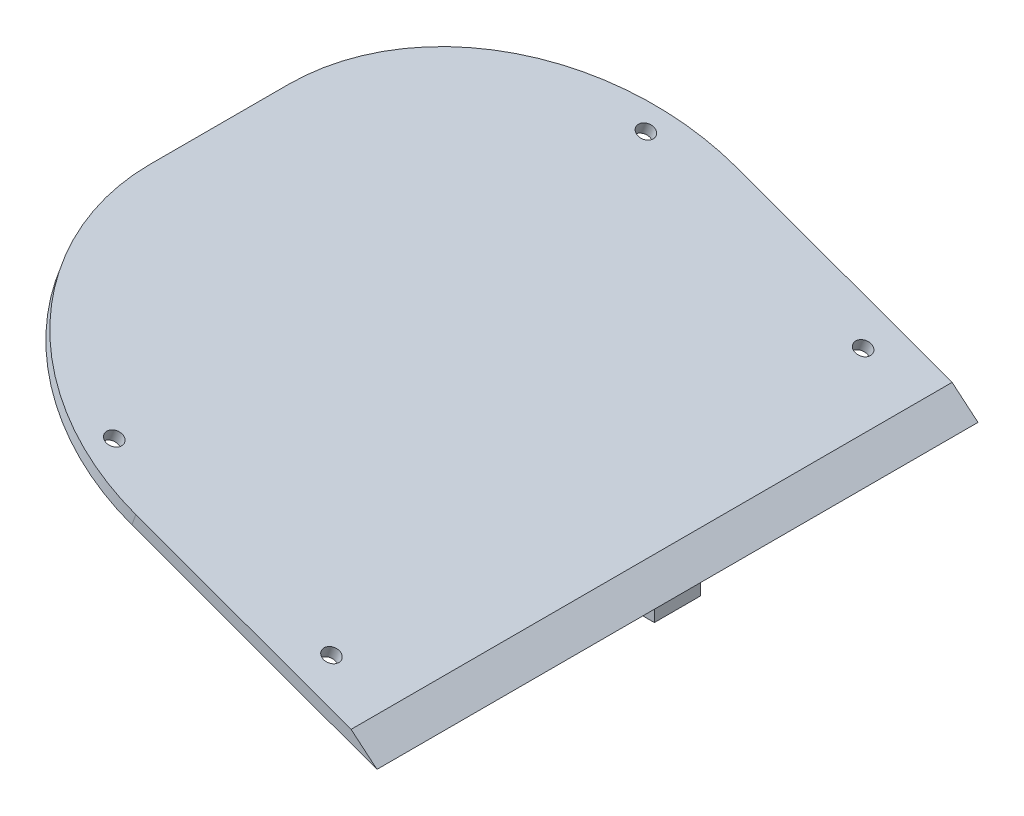
ISO-10303-21;
HEADER;
FILE_DESCRIPTION(('STEP AP214'),'2;1');
FILE_NAME('part.step','',(''),(''),'','','');
FILE_SCHEMA(('AUTOMOTIVE_DESIGN { 1 0 10303 214 1 1 1 1 }'));
ENDSEC;
DATA;
#1=APPLICATION_CONTEXT('core data for automotive mechanical design processes');
#2=APPLICATION_PROTOCOL_DEFINITION('international standard','automotive_design',2000,#1);
#3=PRODUCT_CONTEXT('',#1,'mechanical');
#4=PRODUCT('Part','Part','',(#3));
#5=PRODUCT_RELATED_PRODUCT_CATEGORY('part','',(#4));
#6=PRODUCT_DEFINITION_FORMATION('','',#4);
#7=PRODUCT_DEFINITION_CONTEXT('part definition',#1,'design');
#8=PRODUCT_DEFINITION('design','',#6,#7);
#9=PRODUCT_DEFINITION_SHAPE('','',#8);
#10=(LENGTH_UNIT() NAMED_UNIT(*) SI_UNIT(.MILLI.,.METRE.));
#11=(NAMED_UNIT(*) PLANE_ANGLE_UNIT() SI_UNIT($,.RADIAN.));
#12=(NAMED_UNIT(*) SI_UNIT($,.STERADIAN.) SOLID_ANGLE_UNIT());
#13=UNCERTAINTY_MEASURE_WITH_UNIT(LENGTH_MEASURE(1.E-05),#10,'distance_accuracy_value','');
#14=(GEOMETRIC_REPRESENTATION_CONTEXT(3) GLOBAL_UNCERTAINTY_ASSIGNED_CONTEXT((#13)) GLOBAL_UNIT_ASSIGNED_CONTEXT((#10,
#11,#12)) REPRESENTATION_CONTEXT('',''));
#15=CARTESIAN_POINT('',(0.,0.,0.));
#16=DIRECTION('',(0.,0.,1.));
#17=DIRECTION('',(1.,0.,0.));
#18=AXIS2_PLACEMENT_3D('',#15,#16,#17);
#19=CARTESIAN_POINT('',(1.65853487042235,4.55678710586349,0.));
#20=DIRECTION('',(-0.342020143325669,-0.939692620785908,0.));
#21=DIRECTION('',(0.939692620785908,-0.342020143325669,0.));
#22=AXIS2_PLACEMENT_3D('',#19,#20,#21);
#23=PLANE('',#22);
#24=DIRECTION('',(-0.939692620785908,0.342020143325669,0.));
#25=VECTOR('',#24,1.);
#26=CARTESIAN_POINT('',(0.855050358314189,4.84923155196477,-65.));
#27=LINE('',#26,#25);
#28=CARTESIAN_POINT('',(-5.59941028377931,7.19846310392953,-65.));
#29=VERTEX_POINT('',#28);
#30=CARTESIAN_POINT('',(-52.1603186023903,24.1452478123016,-65.));
#31=VERTEX_POINT('',#30);
#32=EDGE_CURVE('E220',#29,#31,#27,.T.);
#33=ORIENTED_EDGE('',*,*,#32,.T.);
#34=CARTESIAN_POINT('',(-52.1603186023904,24.1452478123016,-15.));
#35=DIRECTION('',(-0.342020143325669,-0.939692620785908,0.));
#36=DIRECTION('',(0.939692620785908,-0.342020143325669,0.));
#37=AXIS2_PLACEMENT_3D('',#34,#35,#36);
#38=CIRCLE('',#37,50.);
#39=CARTESIAN_POINT('',(-99.1449496416858,41.2462549785851,-15.));
#40=VERTEX_POINT('',#39);
#41=EDGE_CURVE('E340',#31,#40,#38,.F.);
#42=ORIENTED_EDGE('',*,*,#41,.T.);
#43=DIRECTION('',(0.,0.,1.));
#44=VECTOR('',#43,1.);
#45=CARTESIAN_POINT('',(-99.1449496416858,41.2462549785851,-65.));
#46=LINE('',#45,#44);
#47=CARTESIAN_POINT('',(-99.1449496416858,41.2462549785851,15.));
#48=VERTEX_POINT('',#47);
#49=EDGE_CURVE('E223',#40,#48,#46,.T.);
#50=ORIENTED_EDGE('',*,*,#49,.T.);
#51=CARTESIAN_POINT('',(-52.1603186023904,24.1452478123016,15.));
#52=DIRECTION('',(-0.342020143325669,-0.939692620785908,0.));
#53=DIRECTION('',(0.939692620785908,-0.342020143325669,0.));
#54=AXIS2_PLACEMENT_3D('',#51,#52,#53);
#55=CIRCLE('',#54,50.);
#56=CARTESIAN_POINT('',(-52.1603186023904,24.1452478123016,65.));
#57=VERTEX_POINT('',#56);
#58=EDGE_CURVE('E59',#48,#57,#55,.F.);
#59=ORIENTED_EDGE('',*,*,#58,.T.);
#60=DIRECTION('',(0.939692620785908,-0.342020143325669,0.));
#61=VECTOR('',#60,1.);
#62=CARTESIAN_POINT('',(0.855050358314189,4.84923155196477,65.));
#63=LINE('',#62,#61);
#64=CARTESIAN_POINT('',(-5.59941028377931,7.19846310392953,65.));
#65=VERTEX_POINT('',#64);
#66=EDGE_CURVE('E226',#57,#65,#63,.T.);
#67=ORIENTED_EDGE('',*,*,#66,.T.);
#68=DIRECTION('',(0.,0.,-1.));
#69=VECTOR('',#68,1.);
#70=CARTESIAN_POINT('',(-5.59941028377932,7.19846310392953,0.));
#71=LINE('',#70,#69);
#72=EDGE_CURVE('E322',#65,#29,#71,.T.);
#73=ORIENTED_EDGE('',*,*,#72,.T.);
#74=EDGE_LOOP('',(#33,#42,#50,#59,#67,#73));
#75=FACE_BOUND('',#74,.T.);
#76=CARTESIAN_POINT('',(-17.3455680436028,11.4737148955003,-57.4999999999997));
#77=DIRECTION('',(0.34202014332567,0.939692620785908,0.));
#78=DIRECTION('',(-0.939692620785908,0.34202014332567,0.));
#79=AXIS2_PLACEMENT_3D('',#76,#77,#78);
#80=CIRCLE('',#79,1.69999999999999);
#81=CARTESIAN_POINT('',(-18.9430454989388,12.0551491391539,-57.4999999999997));
#82=VERTEX_POINT('',#81);
#83=EDGE_CURVE('E772',#82,#82,#80,.T.);
#84=ORIENTED_EDGE('',*,*,#83,.F.);
#85=EDGE_LOOP('',(#84));
#86=FACE_BOUND('',#85,.T.);
#87=CARTESIAN_POINT('',(-17.3455680436028,11.4737148955003,57.4999999999997));
#88=DIRECTION('',(0.34202014332567,0.939692620785908,0.));
#89=DIRECTION('',(-0.939692620785908,0.34202014332567,0.));
#90=AXIS2_PLACEMENT_3D('',#87,#88,#89);
#91=CIRCLE('',#90,1.69999999999999);
#92=CARTESIAN_POINT('',(-18.9430454989388,12.0551491391539,57.4999999999997));
#93=VERTEX_POINT('',#92);
#94=EDGE_CURVE('E766',#93,#93,#91,.T.);
#95=ORIENTED_EDGE('',*,*,#94,.F.);
#96=EDGE_LOOP('',(#95));
#97=FACE_BOUND('',#96,.T.);
#98=CARTESIAN_POINT('',(-64.3301990828997,28.5747220617843,57.4999999999997));
#99=DIRECTION('',(0.34202014332567,0.939692620785908,0.));
#100=DIRECTION('',(-0.939692620785908,0.34202014332567,0.));
#101=AXIS2_PLACEMENT_3D('',#98,#99,#100);
#102=CIRCLE('',#101,1.69999999999999);
#103=CARTESIAN_POINT('',(-65.9276765382357,29.1561563054379,57.4999999999997));
#104=VERTEX_POINT('',#103);
#105=EDGE_CURVE('E757',#104,#104,#102,.T.);
#106=ORIENTED_EDGE('',*,*,#105,.F.);
#107=EDGE_LOOP('',(#106));
#108=FACE_BOUND('',#107,.T.);
#109=CARTESIAN_POINT('',(-64.3301990828997,28.5747220617843,-57.4999999999997));
#110=DIRECTION('',(0.34202014332567,0.939692620785908,0.));
#111=DIRECTION('',(-0.939692620785908,0.34202014332567,0.));
#112=AXIS2_PLACEMENT_3D('',#109,#110,#111);
#113=CIRCLE('',#112,1.69999999999999);
#114=CARTESIAN_POINT('',(-65.9276765382357,29.1561563054379,-57.4999999999997));
#115=VERTEX_POINT('',#114);
#116=EDGE_CURVE('E753',#115,#115,#113,.T.);
#117=ORIENTED_EDGE('',*,*,#116,.F.);
#118=EDGE_LOOP('',(#117));
#119=FACE_BOUND('',#118,.T.);
#120=ADVANCED_FACE('F38',(#75,#86,#97,#108,#119),#23,.F.);
#121=CARTESIAN_POINT('',(0.803484512108176,2.20755555389872,0.));
#122=DIRECTION('',(-0.342020143325669,-0.939692620785908,0.));
#123=DIRECTION('',(0.939692620785908,-0.342020143325669,0.));
#124=AXIS2_PLACEMENT_3D('',#121,#122,#123);
#125=PLANE('',#124);
#126=CARTESIAN_POINT('',(-65.1852494412139,26.2254905098195,-57.4999999999997));
#127=DIRECTION('',(-0.342020143325669,-0.939692620785908,0.));
#128=DIRECTION('',(0.939692620785908,-0.342020143325669,0.));
#129=AXIS2_PLACEMENT_3D('',#126,#127,#128);
#130=CIRCLE('',#129,1.69999999999999);
#131=CARTESIAN_POINT('',(-63.5877719858778,25.6440562661659,-57.4999999999997));
#132=VERTEX_POINT('',#131);
#133=EDGE_CURVE('E756',#132,#132,#130,.T.);
#134=ORIENTED_EDGE('',*,*,#133,.F.);
#135=EDGE_LOOP('',(#134));
#136=FACE_BOUND('',#135,.T.);
#137=DIRECTION('',(0.,0.,1.));
#138=VECTOR('',#137,1.);
#139=CARTESIAN_POINT('',(-100.,38.8970234266203,-65.));
#140=LINE('',#139,#138);
#141=CARTESIAN_POINT('',(-100.,38.8970234266203,-15.));
#142=VERTEX_POINT('',#141);
#143=CARTESIAN_POINT('',(-100.,38.8970234266203,-5.));
#144=VERTEX_POINT('',#143);
#145=EDGE_CURVE('E238',#142,#144,#140,.T.);
#146=ORIENTED_EDGE('',*,*,#145,.F.);
#147=CARTESIAN_POINT('',(-53.0153689607045,21.7960162603368,-15.));
#148=DIRECTION('',(-0.342020143325669,-0.939692620785908,0.));
#149=DIRECTION('',(0.939692620785908,-0.342020143325669,0.));
#150=AXIS2_PLACEMENT_3D('',#147,#148,#149);
#151=CIRCLE('',#150,50.);
#152=CARTESIAN_POINT('',(-53.0153689607045,21.7960162603368,-65.));
#153=VERTEX_POINT('',#152);
#154=EDGE_CURVE('E335',#142,#153,#151,.T.);
#155=ORIENTED_EDGE('',*,*,#154,.T.);
#156=DIRECTION('',(-0.939692620785908,0.342020143325669,0.));
#157=VECTOR('',#156,1.);
#158=CARTESIAN_POINT('',(0.,2.5,-65.));
#159=LINE('',#158,#157);
#160=CARTESIAN_POINT('',(-43.6309785619984,18.3803774884742,-65.));
#161=VERTEX_POINT('',#160);
#162=EDGE_CURVE('E232',#161,#153,#159,.T.);
#163=ORIENTED_EDGE('',*,*,#162,.F.);
#164=DIRECTION('',(0.,0.,1.));
#165=VECTOR('',#164,1.);
#166=CARTESIAN_POINT('',(-43.6309785619984,18.3803774884742,0.));
#167=LINE('',#166,#165);
#168=CARTESIAN_POINT('',(-43.6309785619984,18.3803774884742,-5.));
#169=VERTEX_POINT('',#168);
#170=EDGE_CURVE('E192',#161,#169,#167,.T.);
#171=ORIENTED_EDGE('',*,*,#170,.T.);
#172=DIRECTION('',(-0.939692620785908,0.342020143325669,0.));
#173=VECTOR('',#172,1.);
#174=CARTESIAN_POINT('',(0.,2.5,-5.));
#175=LINE('',#174,#173);
#176=EDGE_CURVE('E200',#169,#144,#175,.T.);
#177=ORIENTED_EDGE('',*,*,#176,.T.);
#178=EDGE_LOOP('',(#146,#155,#163,#171,#177));
#179=FACE_BOUND('',#178,.T.);
#180=ADVANCED_FACE('F403',(#136,#179),#125,.T.);
#181=CARTESIAN_POINT('',(-65.1852494412138,26.2254905098195,57.4999999999997));
#182=DIRECTION('',(-0.342020143325669,-0.939692620785908,0.));
#183=DIRECTION('',(0.939692620785908,-0.342020143325669,0.));
#184=AXIS2_PLACEMENT_3D('',#181,#182,#183);
#185=CIRCLE('',#184,1.69999999999999);
#186=CARTESIAN_POINT('',(-63.5877719858778,25.6440562661659,57.4999999999997));
#187=VERTEX_POINT('',#186);
#188=EDGE_CURVE('E760',#187,#187,#185,.T.);
#189=ORIENTED_EDGE('',*,*,#188,.F.);
#190=EDGE_LOOP('',(#189));
#191=FACE_BOUND('',#190,.T.);
#192=DIRECTION('',(0.939692620785908,-0.342020143325669,0.));
#193=VECTOR('',#192,1.);
#194=CARTESIAN_POINT('',(0.,2.5,65.));
#195=LINE('',#194,#193);
#196=CARTESIAN_POINT('',(-53.0153689607045,21.7960162603368,65.));
#197=VERTEX_POINT('',#196);
#198=CARTESIAN_POINT('',(-43.6309785619983,18.3803774884742,65.));
#199=VERTEX_POINT('',#198);
#200=EDGE_CURVE('E224',#197,#199,#195,.T.);
#201=ORIENTED_EDGE('',*,*,#200,.F.);
#202=CARTESIAN_POINT('',(-53.0153689607045,21.7960162603368,15.));
#203=DIRECTION('',(-0.342020143325669,-0.939692620785908,0.));
#204=DIRECTION('',(0.939692620785908,-0.342020143325669,0.));
#205=AXIS2_PLACEMENT_3D('',#202,#203,#204);
#206=CIRCLE('',#205,50.);
#207=CARTESIAN_POINT('',(-100.,38.8970234266203,15.));
#208=VERTEX_POINT('',#207);
#209=EDGE_CURVE('E11',#197,#208,#206,.T.);
#210=ORIENTED_EDGE('',*,*,#209,.T.);
#211=CARTESIAN_POINT('',(-100.,38.8970234266203,5.));
#212=VERTEX_POINT('',#211);
#213=EDGE_CURVE('E236',#212,#208,#140,.T.);
#214=ORIENTED_EDGE('',*,*,#213,.F.);
#215=DIRECTION('',(-0.939692620785908,0.342020143325669,0.));
#216=VECTOR('',#215,1.);
#217=CARTESIAN_POINT('',(0.,2.5,5.));
#218=LINE('',#217,#216);
#219=CARTESIAN_POINT('',(-43.6309785619984,18.3803774884742,5.));
#220=VERTEX_POINT('',#219);
#221=EDGE_CURVE('E283',#220,#212,#218,.T.);
#222=ORIENTED_EDGE('',*,*,#221,.F.);
#223=DIRECTION('',(0.,0.,1.));
#224=VECTOR('',#223,1.);
#225=CARTESIAN_POINT('',(-43.6309785619984,18.3803774884742,0.));
#226=LINE('',#225,#224);
#227=EDGE_CURVE('E310',#220,#199,#226,.T.);
#228=ORIENTED_EDGE('',*,*,#227,.T.);
#229=EDGE_LOOP('',(#201,#210,#214,#222,#228));
#230=FACE_BOUND('',#229,.T.);
#231=ADVANCED_FACE('F346',(#191,#230),#125,.T.);
#232=CARTESIAN_POINT('',(-80.,4.99999999999999,-5.));
#233=DIRECTION('',(0.,-1.,0.));
#234=DIRECTION('',(1.,0.,0.));
#235=AXIS2_PLACEMENT_3D('',#232,#233,#234);
#236=PLANE('',#235);
#237=CARTESIAN_POINT('',(-80.,4.99999999999999,-5.));
#238=DIRECTION('',(0.,1.,0.));
#239=DIRECTION('',(1.,0.,0.));
#240=AXIS2_PLACEMENT_3D('',#237,#238,#239);
#241=CIRCLE('',#240,7.49999999999999);
#242=CARTESIAN_POINT('',(-72.5,4.99999999999999,-5.));
#243=VERTEX_POINT('',#242);
#244=CARTESIAN_POINT('',(-87.5,4.99999999999999,-5.));
#245=VERTEX_POINT('',#244);
#246=EDGE_CURVE('E249',#243,#245,#241,.T.);
#247=ORIENTED_EDGE('',*,*,#246,.T.);
#248=DIRECTION('',(1.,0.,0.));
#249=VECTOR('',#248,1.);
#250=CARTESIAN_POINT('',(-87.5,4.99999999999999,-5.));
#251=LINE('',#250,#249);
#252=EDGE_CURVE('E251',#245,#243,#251,.T.);
#253=ORIENTED_EDGE('',*,*,#252,.T.);
#254=EDGE_LOOP('',(#247,#253));
#255=FACE_BOUND('',#254,.T.);
#256=CARTESIAN_POINT('',(-80.,4.99999999999999,-8.49999999999999));
#257=DIRECTION('',(0.,1.,0.));
#258=DIRECTION('',(0.,0.,1.));
#259=AXIS2_PLACEMENT_3D('',#256,#257,#258);
#260=CIRCLE('',#259,1.69999999999999);
#261=CARTESIAN_POINT('',(-80.,4.99999999999999,-6.8));
#262=VERTEX_POINT('',#261);
#263=EDGE_CURVE('E228',#262,#262,#260,.T.);
#264=ORIENTED_EDGE('',*,*,#263,.F.);
#265=EDGE_LOOP('',(#264));
#266=FACE_BOUND('',#265,.T.);
#267=ADVANCED_FACE('F427',(#255,#266),#236,.F.);
#268=CARTESIAN_POINT('',(0.,0.,-5.));
#269=DIRECTION('',(0.,0.,1.));
#270=DIRECTION('',(1.,0.,0.));
#271=AXIS2_PLACEMENT_3D('',#268,#269,#270);
#272=PLANE('',#271);
#273=DIRECTION('',(0.939692620785908,-0.342020143325669,0.));
#274=VECTOR('',#273,1.);
#275=CARTESIAN_POINT('',(-3.55389931319467,-9.76425811401762,-5.));
#276=LINE('',#275,#274);
#277=CARTESIAN_POINT('',(-47.9883623873012,6.40856382055788,-5.));
#278=VERTEX_POINT('',#277);
#279=CARTESIAN_POINT('',(-38.5914361794421,2.98836238730119,-5.));
#280=VERTEX_POINT('',#279);
#281=EDGE_CURVE('E175',#278,#280,#276,.T.);
#282=ORIENTED_EDGE('',*,*,#281,.T.);
#283=DIRECTION('',(0.342020143325669,0.939692620785908,0.));
#284=VECTOR('',#283,1.);
#285=CARTESIAN_POINT('',(-35.0375368662475,12.7526205013188,-5.));
#286=LINE('',#285,#284);
#287=CARTESIAN_POINT('',(-34.2340523541393,14.9601760552175,-5.));
#288=VERTEX_POINT('',#287);
#289=EDGE_CURVE('E186',#280,#288,#286,.T.);
#290=ORIENTED_EDGE('',*,*,#289,.T.);
#291=CARTESIAN_POINT('',(0.,2.5,-5.));
#292=VERTEX_POINT('',#291);
#293=EDGE_CURVE('E296',#292,#288,#175,.T.);
#294=ORIENTED_EDGE('',*,*,#293,.F.);
#295=DIRECTION('',(0.,1.,0.));
#296=VECTOR('',#295,1.);
#297=CARTESIAN_POINT('',(0.,0.,-5.));
#298=LINE('',#297,#296);
#299=CARTESIAN_POINT('',(0.,0.,-5.));
#300=VERTEX_POINT('',#299);
#301=EDGE_CURVE('E293',#300,#292,#298,.T.);
#302=ORIENTED_EDGE('',*,*,#301,.F.);
#303=DIRECTION('',(1.,0.,0.));
#304=VECTOR('',#303,1.);
#305=CARTESIAN_POINT('',(0.,0.,-5.));
#306=LINE('',#305,#304);
#307=CARTESIAN_POINT('',(-72.5,0.,-5.));
#308=VERTEX_POINT('',#307);
#309=EDGE_CURVE('E302',#308,#300,#306,.T.);
#310=ORIENTED_EDGE('',*,*,#309,.F.);
#311=DIRECTION('',(0.,-1.,0.));
#312=VECTOR('',#311,1.);
#313=CARTESIAN_POINT('',(-72.5,4.99999999999999,-5.));
#314=LINE('',#313,#312);
#315=EDGE_CURVE('E253',#243,#308,#314,.T.);
#316=ORIENTED_EDGE('',*,*,#315,.F.);
#317=ORIENTED_EDGE('',*,*,#252,.F.);
#318=DIRECTION('',(0.,-1.,0.));
#319=VECTOR('',#318,1.);
#320=CARTESIAN_POINT('',(-87.5,4.99999999999999,-5.));
#321=LINE('',#320,#319);
#322=CARTESIAN_POINT('',(-87.5,0.,-5.));
#323=VERTEX_POINT('',#322);
#324=EDGE_CURVE('E255',#245,#323,#321,.T.);
#325=ORIENTED_EDGE('',*,*,#324,.T.);
#326=CARTESIAN_POINT('',(-100.,0.,-5.));
#327=VERTEX_POINT('',#326);
#328=EDGE_CURVE('E303',#327,#323,#306,.T.);
#329=ORIENTED_EDGE('',*,*,#328,.F.);
#330=DIRECTION('',(0.,-1.,0.));
#331=VECTOR('',#330,1.);
#332=CARTESIAN_POINT('',(-100.,0.,-5.));
#333=LINE('',#332,#331);
#334=EDGE_CURVE('E299',#144,#327,#333,.T.);
#335=ORIENTED_EDGE('',*,*,#334,.F.);
#336=ORIENTED_EDGE('',*,*,#176,.F.);
#337=DIRECTION('',(0.342020143325669,0.939692620785908,0.));
#338=VECTOR('',#337,1.);
#339=CARTESIAN_POINT('',(-44.4344630741065,16.1728219345755,-5.));
#340=LINE('',#339,#338);
#341=EDGE_CURVE('E190',#278,#169,#340,.T.);
#342=ORIENTED_EDGE('',*,*,#341,.F.);
#343=EDGE_LOOP('',(#282,#290,#294,#302,#310,#316,#317,#325,#329,#335,#336,#342));
#344=FACE_BOUND('',#343,.T.);
#345=ADVANCED_FACE('F197',(#344),#272,.F.);
#346=CARTESIAN_POINT('',(-80.,4.99999999999999,5.));
#347=DIRECTION('',(0.,-1.,0.));
#348=DIRECTION('',(1.,0.,0.));
#349=AXIS2_PLACEMENT_3D('',#346,#347,#348);
#350=PLANE('',#349);
#351=CARTESIAN_POINT('',(-80.,4.99999999999999,5.));
#352=DIRECTION('',(0.,-1.,0.));
#353=DIRECTION('',(1.,0.,0.));
#354=AXIS2_PLACEMENT_3D('',#351,#352,#353);
#355=CIRCLE('',#354,7.49999999999999);
#356=CARTESIAN_POINT('',(-72.5,4.99999999999999,5.));
#357=VERTEX_POINT('',#356);
#358=CARTESIAN_POINT('',(-87.5,4.99999999999999,5.));
#359=VERTEX_POINT('',#358);
#360=EDGE_CURVE('E267',#357,#359,#355,.T.);
#361=ORIENTED_EDGE('',*,*,#360,.F.);
#362=DIRECTION('',(1.,0.,0.));
#363=VECTOR('',#362,1.);
#364=CARTESIAN_POINT('',(-87.5,4.99999999999999,5.));
#365=LINE('',#364,#363);
#366=EDGE_CURVE('E270',#359,#357,#365,.T.);
#367=ORIENTED_EDGE('',*,*,#366,.F.);
#368=EDGE_LOOP('',(#361,#367));
#369=FACE_BOUND('',#368,.T.);
#370=CARTESIAN_POINT('',(-80.,4.99999999999999,8.49999999999999));
#371=DIRECTION('',(0.,1.,0.));
#372=DIRECTION('',(0.,0.,1.));
#373=AXIS2_PLACEMENT_3D('',#370,#371,#372);
#374=CIRCLE('',#373,1.69999999999999);
#375=CARTESIAN_POINT('',(-80.,4.99999999999999,10.2));
#376=VERTEX_POINT('',#375);
#377=EDGE_CURVE('E258',#376,#376,#374,.T.);
#378=ORIENTED_EDGE('',*,*,#377,.F.);
#379=EDGE_LOOP('',(#378));
#380=FACE_BOUND('',#379,.T.);
#381=ADVANCED_FACE('F439',(#369,#380),#350,.F.);
#382=CARTESIAN_POINT('',(0.,0.,-5.));
#383=DIRECTION('',(1.,0.,0.));
#384=DIRECTION('',(0.,0.,-1.));
#385=AXIS2_PLACEMENT_3D('',#382,#383,#384);
#386=PLANE('',#385);
#387=DIRECTION('',(0.,0.,1.));
#388=VECTOR('',#387,1.);
#389=CARTESIAN_POINT('',(0.,2.5,-5.));
#390=LINE('',#389,#388);
#391=CARTESIAN_POINT('',(0.,2.5,5.));
#392=VERTEX_POINT('',#391);
#393=EDGE_CURVE('E306',#292,#392,#390,.T.);
#394=ORIENTED_EDGE('',*,*,#393,.T.);
#395=DIRECTION('',(0.,1.,0.));
#396=VECTOR('',#395,1.);
#397=CARTESIAN_POINT('',(0.,0.,5.));
#398=LINE('',#397,#396);
#399=CARTESIAN_POINT('',(0.,0.,5.));
#400=VERTEX_POINT('',#399);
#401=EDGE_CURVE('E278',#400,#392,#398,.T.);
#402=ORIENTED_EDGE('',*,*,#401,.F.);
#403=DIRECTION('',(0.,0.,1.));
#404=VECTOR('',#403,1.);
#405=CARTESIAN_POINT('',(0.,0.,-5.));
#406=LINE('',#405,#404);
#407=EDGE_CURVE('E307',#300,#400,#406,.T.);
#408=ORIENTED_EDGE('',*,*,#407,.F.);
#409=ORIENTED_EDGE('',*,*,#301,.T.);
#410=EDGE_LOOP('',(#394,#402,#408,#409));
#411=FACE_BOUND('',#410,.T.);
#412=ADVANCED_FACE('F442',(#411),#386,.T.);
#413=CARTESIAN_POINT('',(0.,0.,-5.));
#414=DIRECTION('',(0.,-1.,0.));
#415=DIRECTION('',(1.,0.,0.));
#416=AXIS2_PLACEMENT_3D('',#413,#414,#415);
#417=PLANE('',#416);
#418=CARTESIAN_POINT('',(-80.,0.,-8.49999999999999));
#419=DIRECTION('',(0.,-1.,0.));
#420=DIRECTION('',(1.,0.,0.));
#421=AXIS2_PLACEMENT_3D('',#418,#419,#420);
#422=CIRCLE('',#421,1.69999999999999);
#423=CARTESIAN_POINT('',(-78.3,0.,-8.49999999999999));
#424=VERTEX_POINT('',#423);
#425=EDGE_CURVE('E245',#424,#424,#422,.T.);
#426=ORIENTED_EDGE('',*,*,#425,.F.);
#427=EDGE_LOOP('',(#426));
#428=FACE_BOUND('',#427,.T.);
#429=CARTESIAN_POINT('',(-80.,0.,8.49999999999999));
#430=DIRECTION('',(0.,-1.,0.));
#431=DIRECTION('',(1.,0.,0.));
#432=AXIS2_PLACEMENT_3D('',#429,#430,#431);
#433=CIRCLE('',#432,1.69999999999999);
#434=CARTESIAN_POINT('',(-78.3,0.,8.49999999999999));
#435=VERTEX_POINT('',#434);
#436=EDGE_CURVE('E263',#435,#435,#433,.T.);
#437=ORIENTED_EDGE('',*,*,#436,.F.);
#438=EDGE_LOOP('',(#437));
#439=FACE_BOUND('',#438,.T.);
#440=ORIENTED_EDGE('',*,*,#407,.T.);
#441=DIRECTION('',(1.,0.,0.));
#442=VECTOR('',#441,1.);
#443=CARTESIAN_POINT('',(0.,0.,5.));
#444=LINE('',#443,#442);
#445=CARTESIAN_POINT('',(-72.5,0.,5.));
#446=VERTEX_POINT('',#445);
#447=EDGE_CURVE('E290',#446,#400,#444,.T.);
#448=ORIENTED_EDGE('',*,*,#447,.F.);
#449=CARTESIAN_POINT('',(-80.,0.,5.));
#450=DIRECTION('',(0.,-1.,0.));
#451=DIRECTION('',(1.,0.,0.));
#452=AXIS2_PLACEMENT_3D('',#449,#450,#451);
#453=CIRCLE('',#452,7.49999999999999);
#454=CARTESIAN_POINT('',(-87.5,0.,5.));
#455=VERTEX_POINT('',#454);
#456=EDGE_CURVE('E266',#446,#455,#453,.T.);
#457=ORIENTED_EDGE('',*,*,#456,.T.);
#458=CARTESIAN_POINT('',(-100.,0.,5.));
#459=VERTEX_POINT('',#458);
#460=EDGE_CURVE('E291',#459,#455,#444,.T.);
#461=ORIENTED_EDGE('',*,*,#460,.F.);
#462=DIRECTION('',(0.,0.,1.));
#463=VECTOR('',#462,1.);
#464=CARTESIAN_POINT('',(-100.,0.,-5.));
#465=LINE('',#464,#463);
#466=EDGE_CURVE('E311',#327,#459,#465,.T.);
#467=ORIENTED_EDGE('',*,*,#466,.F.);
#468=ORIENTED_EDGE('',*,*,#328,.T.);
#469=CARTESIAN_POINT('',(-80.,0.,-5.));
#470=DIRECTION('',(0.,1.,0.));
#471=DIRECTION('',(1.,0.,0.));
#472=AXIS2_PLACEMENT_3D('',#469,#470,#471);
#473=CIRCLE('',#472,7.49999999999999);
#474=EDGE_CURVE('E248',#308,#323,#473,.T.);
#475=ORIENTED_EDGE('',*,*,#474,.F.);
#476=ORIENTED_EDGE('',*,*,#309,.T.);
#477=EDGE_LOOP('',(#440,#448,#457,#461,#467,#468,#475,#476));
#478=FACE_BOUND('',#477,.T.);
#479=ADVANCED_FACE('F452',(#428,#439,#478),#417,.T.);
#480=CARTESIAN_POINT('',(-100.,0.,-5.));
#481=DIRECTION('',(-1.,0.,0.));
#482=DIRECTION('',(0.,0.,1.));
#483=AXIS2_PLACEMENT_3D('',#480,#481,#482);
#484=PLANE('',#483);
#485=ORIENTED_EDGE('',*,*,#466,.T.);
#486=DIRECTION('',(0.,-1.,0.));
#487=VECTOR('',#486,1.);
#488=CARTESIAN_POINT('',(-100.,0.,5.));
#489=LINE('',#488,#487);
#490=EDGE_CURVE('E287',#212,#459,#489,.T.);
#491=ORIENTED_EDGE('',*,*,#490,.F.);
#492=DIRECTION('',(0.,0.,1.));
#493=VECTOR('',#492,1.);
#494=CARTESIAN_POINT('',(-100.,38.8970234266203,-5.));
#495=LINE('',#494,#493);
#496=EDGE_CURVE('E313',#144,#212,#495,.T.);
#497=ORIENTED_EDGE('',*,*,#496,.F.);
#498=ORIENTED_EDGE('',*,*,#334,.T.);
#499=EDGE_LOOP('',(#485,#491,#497,#498));
#500=FACE_BOUND('',#499,.T.);
#501=ADVANCED_FACE('F449',(#500),#484,.T.);
#502=CARTESIAN_POINT('',(0.,0.,5.));
#503=DIRECTION('',(0.,0.,1.));
#504=DIRECTION('',(1.,0.,0.));
#505=AXIS2_PLACEMENT_3D('',#502,#503,#504);
#506=PLANE('',#505);
#507=DIRECTION('',(0.342020143325669,0.939692620785908,0.));
#508=VECTOR('',#507,1.);
#509=CARTESIAN_POINT('',(-35.0375368662475,12.7526205013188,5.));
#510=LINE('',#509,#508);
#511=CARTESIAN_POINT('',(-38.5914361794421,2.98836238730119,5.));
#512=VERTEX_POINT('',#511);
#513=CARTESIAN_POINT('',(-34.2340523541393,14.9601760552175,5.));
#514=VERTEX_POINT('',#513);
#515=EDGE_CURVE('E215',#512,#514,#510,.T.);
#516=ORIENTED_EDGE('',*,*,#515,.F.);
#517=DIRECTION('',(-0.939692620785908,0.342020143325669,0.));
#518=VECTOR('',#517,1.);
#519=CARTESIAN_POINT('',(-3.55389931319467,-9.76425811401762,5.));
#520=LINE('',#519,#518);
#521=CARTESIAN_POINT('',(-47.9883623873012,6.40856382055788,5.));
#522=VERTEX_POINT('',#521);
#523=EDGE_CURVE('E217',#522,#512,#520,.F.);
#524=ORIENTED_EDGE('',*,*,#523,.F.);
#525=DIRECTION('',(0.342020143325669,0.939692620785908,0.));
#526=VECTOR('',#525,1.);
#527=CARTESIAN_POINT('',(-44.4344630741065,16.1728219345755,5.));
#528=LINE('',#527,#526);
#529=EDGE_CURVE('E210',#522,#220,#528,.T.);
#530=ORIENTED_EDGE('',*,*,#529,.T.);
#531=ORIENTED_EDGE('',*,*,#221,.T.);
#532=ORIENTED_EDGE('',*,*,#490,.T.);
#533=ORIENTED_EDGE('',*,*,#460,.T.);
#534=DIRECTION('',(0.,-1.,0.));
#535=VECTOR('',#534,1.);
#536=CARTESIAN_POINT('',(-87.5,4.99999999999999,5.));
#537=LINE('',#536,#535);
#538=EDGE_CURVE('E272',#359,#455,#537,.T.);
#539=ORIENTED_EDGE('',*,*,#538,.F.);
#540=ORIENTED_EDGE('',*,*,#366,.T.);
#541=DIRECTION('',(0.,-1.,0.));
#542=VECTOR('',#541,1.);
#543=CARTESIAN_POINT('',(-72.5,4.99999999999999,5.));
#544=LINE('',#543,#542);
#545=EDGE_CURVE('E275',#357,#446,#544,.T.);
#546=ORIENTED_EDGE('',*,*,#545,.T.);
#547=ORIENTED_EDGE('',*,*,#447,.T.);
#548=ORIENTED_EDGE('',*,*,#401,.T.);
#549=EDGE_CURVE('E284',#392,#514,#218,.T.);
#550=ORIENTED_EDGE('',*,*,#549,.T.);
#551=EDGE_LOOP('',(#516,#524,#530,#531,#532,#533,#539,#540,#546,#547,#548,#550));
#552=FACE_BOUND('',#551,.T.);
#553=ADVANCED_FACE('F357',(#552),#506,.T.);
#554=CARTESIAN_POINT('',(-80.,4.99999999999999,5.));
#555=DIRECTION('',(0.,-1.,0.));
#556=DIRECTION('',(1.,0.,0.));
#557=AXIS2_PLACEMENT_3D('',#554,#555,#556);
#558=CYLINDRICAL_SURFACE('',#557,7.49999999999999);
#559=ORIENTED_EDGE('',*,*,#456,.F.);
#560=ORIENTED_EDGE('',*,*,#545,.F.);
#561=ORIENTED_EDGE('',*,*,#360,.T.);
#562=ORIENTED_EDGE('',*,*,#538,.T.);
#563=EDGE_LOOP('',(#559,#560,#561,#562));
#564=FACE_BOUND('',#563,.T.);
#565=ADVANCED_FACE('F437',(#564),#558,.T.);
#566=CARTESIAN_POINT('',(-80.,4.99999999999999,8.49999999999999));
#567=DIRECTION('',(0.,1.,0.));
#568=DIRECTION('',(0.,0.,1.));
#569=AXIS2_PLACEMENT_3D('',#566,#567,#568);
#570=CYLINDRICAL_SURFACE('',#569,1.69999999999999);
#571=ORIENTED_EDGE('',*,*,#377,.T.);
#572=EDGE_LOOP('',(#571));
#573=FACE_BOUND('',#572,.T.);
#574=ORIENTED_EDGE('',*,*,#436,.T.);
#575=EDGE_LOOP('',(#574));
#576=FACE_BOUND('',#575,.T.);
#577=ADVANCED_FACE('F433',(#573,#576),#570,.F.);
#578=CARTESIAN_POINT('',(-80.,4.99999999999999,-5.));
#579=DIRECTION('',(0.,-1.,0.));
#580=DIRECTION('',(1.,0.,0.));
#581=AXIS2_PLACEMENT_3D('',#578,#579,#580);
#582=CYLINDRICAL_SURFACE('',#581,7.49999999999999);
#583=ORIENTED_EDGE('',*,*,#474,.T.);
#584=ORIENTED_EDGE('',*,*,#324,.F.);
#585=ORIENTED_EDGE('',*,*,#246,.F.);
#586=ORIENTED_EDGE('',*,*,#315,.T.);
#587=EDGE_LOOP('',(#583,#584,#585,#586));
#588=FACE_BOUND('',#587,.T.);
#589=ADVANCED_FACE('F425',(#588),#582,.T.);
#590=CARTESIAN_POINT('',(-80.,4.99999999999999,-8.49999999999999));
#591=DIRECTION('',(0.,1.,0.));
#592=DIRECTION('',(0.,0.,1.));
#593=AXIS2_PLACEMENT_3D('',#590,#591,#592);
#594=CYLINDRICAL_SURFACE('',#593,1.69999999999999);
#595=ORIENTED_EDGE('',*,*,#263,.T.);
#596=EDGE_LOOP('',(#595));
#597=FACE_BOUND('',#596,.T.);
#598=ORIENTED_EDGE('',*,*,#425,.T.);
#599=EDGE_LOOP('',(#598));
#600=FACE_BOUND('',#599,.T.);
#601=ADVANCED_FACE('F422',(#597,#600),#594,.F.);
#602=CARTESIAN_POINT('',(-18.200618401917,9.12448334353548,-57.4999999999997));
#603=DIRECTION('',(-0.342020143325669,-0.939692620785908,0.));
#604=DIRECTION('',(0.939692620785908,-0.342020143325669,0.));
#605=AXIS2_PLACEMENT_3D('',#602,#603,#604);
#606=CIRCLE('',#605,1.69999999999999);
#607=CARTESIAN_POINT('',(-16.6031409465809,8.54304909988185,-57.4999999999997));
#608=VERTEX_POINT('',#607);
#609=EDGE_CURVE('E194',#608,#608,#606,.T.);
#610=ORIENTED_EDGE('',*,*,#609,.F.);
#611=EDGE_LOOP('',(#610));
#612=FACE_BOUND('',#611,.T.);
#613=DIRECTION('',(0.,0.,1.));
#614=VECTOR('',#613,1.);
#615=CARTESIAN_POINT('',(-34.2340523541393,14.9601760552175,0.));
#616=LINE('',#615,#614);
#617=CARTESIAN_POINT('',(-34.2340523541393,14.9601760552175,-65.));
#618=VERTEX_POINT('',#617);
#619=EDGE_CURVE('E201',#618,#288,#616,.T.);
#620=ORIENTED_EDGE('',*,*,#619,.F.);
#621=CARTESIAN_POINT('',(0.,2.5,-65.));
#622=VERTEX_POINT('',#621);
#623=EDGE_CURVE('E233',#622,#618,#159,.T.);
#624=ORIENTED_EDGE('',*,*,#623,.F.);
#625=DIRECTION('',(0.,0.,-1.));
#626=VECTOR('',#625,1.);
#627=CARTESIAN_POINT('',(0.,2.5,-65.));
#628=LINE('',#627,#626);
#629=EDGE_CURVE('E219',#292,#622,#628,.T.);
#630=ORIENTED_EDGE('',*,*,#629,.F.);
#631=ORIENTED_EDGE('',*,*,#293,.T.);
#632=EDGE_LOOP('',(#620,#624,#630,#631));
#633=FACE_BOUND('',#632,.T.);
#634=ADVANCED_FACE('F415',(#612,#633),#125,.T.);
#635=CARTESIAN_POINT('',(0.855050358314189,4.84923155196477,-65.));
#636=DIRECTION('',(0.,0.,1.));
#637=DIRECTION('',(1.,0.,0.));
#638=AXIS2_PLACEMENT_3D('',#635,#636,#637);
#639=PLANE('',#638);
#640=ORIENTED_EDGE('',*,*,#162,.T.);
#641=DIRECTION('',(-0.342020143325669,-0.939692620785908,0.));
#642=VECTOR('',#641,1.);
#643=CARTESIAN_POINT('',(-52.1603186023904,24.1452478123016,-65.));
#644=LINE('',#643,#642);
#645=EDGE_CURVE('E337',#153,#31,#644,.F.);
#646=ORIENTED_EDGE('',*,*,#645,.T.);
#647=ORIENTED_EDGE('',*,*,#32,.F.);
#648=DIRECTION('',(-0.766044443118977,0.64278760968654,0.));
#649=VECTOR('',#648,1.);
#650=CARTESIAN_POINT('',(-5.59941028377931,7.19846310392952,-65.));
#651=LINE('',#650,#649);
#652=EDGE_CURVE('E325',#29,#622,#651,.F.);
#653=ORIENTED_EDGE('',*,*,#652,.T.);
#654=ORIENTED_EDGE('',*,*,#623,.T.);
#655=EDGE_CURVE('E237',#618,#161,#159,.T.);
#656=ORIENTED_EDGE('',*,*,#655,.T.);
#657=EDGE_LOOP('',(#640,#646,#647,#653,#654,#656));
#658=FACE_BOUND('',#657,.T.);
#659=ADVANCED_FACE('F382',(#658),#639,.F.);
#660=CARTESIAN_POINT('',(-99.1449496416858,41.2462549785851,-65.));
#661=DIRECTION('',(0.939692620785908,-0.342020143325669,0.));
#662=DIRECTION('',(0.342020143325669,0.939692620785908,0.));
#663=AXIS2_PLACEMENT_3D('',#660,#661,#662);
#664=PLANE('',#663);
#665=ORIENTED_EDGE('',*,*,#49,.F.);
#666=DIRECTION('',(-0.342020143325669,-0.939692620785908,0.));
#667=VECTOR('',#666,1.);
#668=CARTESIAN_POINT('',(-99.1449496416858,41.2462549785851,-15.));
#669=LINE('',#668,#667);
#670=EDGE_CURVE('E332',#40,#142,#669,.T.);
#671=ORIENTED_EDGE('',*,*,#670,.T.);
#672=ORIENTED_EDGE('',*,*,#145,.T.);
#673=ORIENTED_EDGE('',*,*,#496,.T.);
#674=ORIENTED_EDGE('',*,*,#213,.T.);
#675=DIRECTION('',(-0.342020143325669,-0.939692620785908,0.));
#676=VECTOR('',#675,1.);
#677=CARTESIAN_POINT('',(-99.1449496416858,41.2462549785851,15.));
#678=LINE('',#677,#676);
#679=EDGE_CURVE('E330',#208,#48,#678,.F.);
#680=ORIENTED_EDGE('',*,*,#679,.T.);
#681=EDGE_LOOP('',(#665,#671,#672,#673,#674,#680));
#682=FACE_BOUND('',#681,.T.);
#683=ADVANCED_FACE('F391',(#682),#664,.F.);
#684=CARTESIAN_POINT('',(0.855050358314189,4.84923155196477,65.));
#685=DIRECTION('',(0.,0.,-1.));
#686=DIRECTION('',(-1.,0.,0.));
#687=AXIS2_PLACEMENT_3D('',#684,#685,#686);
#688=PLANE('',#687);
#689=ORIENTED_EDGE('',*,*,#66,.F.);
#690=DIRECTION('',(-0.342020143325669,-0.939692620785908,0.));
#691=VECTOR('',#690,1.);
#692=CARTESIAN_POINT('',(-52.1603186023904,24.1452478123016,65.));
#693=LINE('',#692,#691);
#694=EDGE_CURVE('E46',#57,#197,#693,.T.);
#695=ORIENTED_EDGE('',*,*,#694,.T.);
#696=ORIENTED_EDGE('',*,*,#200,.T.);
#697=CARTESIAN_POINT('',(-34.2340523541393,14.9601760552175,65.));
#698=VERTEX_POINT('',#697);
#699=EDGE_CURVE('E242',#199,#698,#195,.T.);
#700=ORIENTED_EDGE('',*,*,#699,.T.);
#701=CARTESIAN_POINT('',(0.,2.5,65.));
#702=VERTEX_POINT('',#701);
#703=EDGE_CURVE('E240',#698,#702,#195,.T.);
#704=ORIENTED_EDGE('',*,*,#703,.T.);
#705=DIRECTION('',(0.766044443118977,-0.64278760968654,0.));
#706=VECTOR('',#705,1.);
#707=CARTESIAN_POINT('',(-5.59941028377931,7.19846310392952,65.));
#708=LINE('',#707,#706);
#709=EDGE_CURVE('E327',#702,#65,#708,.F.);
#710=ORIENTED_EDGE('',*,*,#709,.T.);
#711=EDGE_LOOP('',(#689,#695,#696,#700,#704,#710));
#712=FACE_BOUND('',#711,.T.);
#713=ADVANCED_FACE('F343',(#712),#688,.F.);
#714=CARTESIAN_POINT('',(-18.2006184019169,9.12448334353548,57.4999999999997));
#715=DIRECTION('',(-0.342020143325669,-0.939692620785908,0.));
#716=DIRECTION('',(0.939692620785908,-0.342020143325669,0.));
#717=AXIS2_PLACEMENT_3D('',#714,#715,#716);
#718=CIRCLE('',#717,1.69999999999999);
#719=CARTESIAN_POINT('',(-16.6031409465809,8.54304909988185,57.4999999999997));
#720=VERTEX_POINT('',#719);
#721=EDGE_CURVE('E769',#720,#720,#718,.T.);
#722=ORIENTED_EDGE('',*,*,#721,.F.);
#723=EDGE_LOOP('',(#722));
#724=FACE_BOUND('',#723,.T.);
#725=DIRECTION('',(0.,0.,1.));
#726=VECTOR('',#725,1.);
#727=CARTESIAN_POINT('',(-34.2340523541393,14.9601760552175,0.));
#728=LINE('',#727,#726);
#729=EDGE_CURVE('E320',#514,#698,#728,.T.);
#730=ORIENTED_EDGE('',*,*,#729,.F.);
#731=ORIENTED_EDGE('',*,*,#549,.F.);
#732=EDGE_CURVE('E229',#702,#392,#628,.T.);
#733=ORIENTED_EDGE('',*,*,#732,.F.);
#734=ORIENTED_EDGE('',*,*,#703,.F.);
#735=EDGE_LOOP('',(#730,#731,#733,#734));
#736=FACE_BOUND('',#735,.T.);
#737=ADVANCED_FACE('F366',(#724,#736),#125,.T.);
#738=CARTESIAN_POINT('',(-43.2898992833717,4.69846310392954,5.));
#739=DIRECTION('',(0.334561206896725,0.919199361374235,-0.207704917825761));
#740=DIRECTION('',(0.071039265764213,0.195178778581811,0.978191528848514));
#741=AXIS2_PLACEMENT_3D('',#738,#739,#740);
#742=PLANE('',#741);
#743=DIRECTION('',(0.071039265764213,0.195178778581811,0.978191528848514));
#744=VECTOR('',#743,1.);
#745=CARTESIAN_POINT('',(-47.9883623873012,6.40856382055788,5.));
#746=LINE('',#745,#744);
#747=EDGE_CURVE('E185',#522,#199,#746,.T.);
#748=ORIENTED_EDGE('',*,*,#747,.F.);
#749=ORIENTED_EDGE('',*,*,#523,.T.);
#750=DIRECTION('',(0.071039265764213,0.195178778581811,0.978191528848514));
#751=VECTOR('',#750,1.);
#752=CARTESIAN_POINT('',(-38.5914361794421,2.98836238730119,5.));
#753=LINE('',#752,#751);
#754=EDGE_CURVE('E207',#512,#698,#753,.T.);
#755=ORIENTED_EDGE('',*,*,#754,.T.);
#756=ORIENTED_EDGE('',*,*,#699,.F.);
#757=EDGE_LOOP('',(#748,#749,#755,#756));
#758=FACE_BOUND('',#757,.T.);
#759=ADVANCED_FACE('F360',(#758),#742,.F.);
#760=CARTESIAN_POINT('',(-34.2082694310363,15.0310140542506,0.));
#761=DIRECTION('',(0.939692620785908,-0.342020143325669,0.));
#762=DIRECTION('',(0.342020143325669,0.939692620785908,0.));
#763=AXIS2_PLACEMENT_3D('',#760,#761,#762);
#764=PLANE('',#763);
#765=ORIENTED_EDGE('',*,*,#754,.F.);
#766=ORIENTED_EDGE('',*,*,#515,.T.);
#767=ORIENTED_EDGE('',*,*,#729,.T.);
#768=EDGE_LOOP('',(#765,#766,#767));
#769=FACE_BOUND('',#768,.T.);
#770=ADVANCED_FACE('F363',(#769),#764,.T.);
#771=CARTESIAN_POINT('',(-43.6051956388954,18.4512154875072,0.));
#772=DIRECTION('',(0.939692620785908,-0.342020143325669,0.));
#773=DIRECTION('',(0.342020143325669,0.939692620785908,0.));
#774=AXIS2_PLACEMENT_3D('',#771,#772,#773);
#775=PLANE('',#774);
#776=ORIENTED_EDGE('',*,*,#529,.F.);
#777=ORIENTED_EDGE('',*,*,#747,.T.);
#778=ORIENTED_EDGE('',*,*,#227,.F.);
#779=EDGE_LOOP('',(#776,#777,#778));
#780=FACE_BOUND('',#779,.T.);
#781=ADVANCED_FACE('F351',(#780),#775,.F.);
#782=CARTESIAN_POINT('',(-43.2898992833717,4.69846310392954,-5.));
#783=DIRECTION('',(-0.334561206896725,-0.919199361374235,-0.207704917825761));
#784=DIRECTION('',(0.071039265764213,0.195178778581811,-0.978191528848514));
#785=AXIS2_PLACEMENT_3D('',#782,#783,#784);
#786=PLANE('',#785);
#787=ORIENTED_EDGE('',*,*,#281,.F.);
#788=DIRECTION('',(0.071039265764213,0.195178778581811,-0.978191528848514));
#789=VECTOR('',#788,1.);
#790=CARTESIAN_POINT('',(-47.9883623873012,6.40856382055788,-5.));
#791=LINE('',#790,#789);
#792=EDGE_CURVE('E178',#278,#161,#791,.T.);
#793=ORIENTED_EDGE('',*,*,#792,.T.);
#794=ORIENTED_EDGE('',*,*,#655,.F.);
#795=DIRECTION('',(0.071039265764213,0.195178778581811,-0.978191528848514));
#796=VECTOR('',#795,1.);
#797=CARTESIAN_POINT('',(-38.5914361794421,2.98836238730119,-5.));
#798=LINE('',#797,#796);
#799=EDGE_CURVE('E181',#280,#618,#798,.T.);
#800=ORIENTED_EDGE('',*,*,#799,.F.);
#801=EDGE_LOOP('',(#787,#793,#794,#800));
#802=FACE_BOUND('',#801,.T.);
#803=ADVANCED_FACE('F177',(#802),#786,.T.);
#804=CARTESIAN_POINT('',(-34.2082694310363,15.0310140542506,0.));
#805=DIRECTION('',(0.939692620785908,-0.342020143325669,0.));
#806=DIRECTION('',(0.342020143325669,0.939692620785908,0.));
#807=AXIS2_PLACEMENT_3D('',#804,#805,#806);
#808=PLANE('',#807);
#809=ORIENTED_EDGE('',*,*,#289,.F.);
#810=ORIENTED_EDGE('',*,*,#799,.T.);
#811=ORIENTED_EDGE('',*,*,#619,.T.);
#812=EDGE_LOOP('',(#809,#810,#811));
#813=FACE_BOUND('',#812,.T.);
#814=ADVANCED_FACE('F468',(#813),#808,.T.);
#815=CARTESIAN_POINT('',(-43.6051956388954,18.4512154875072,0.));
#816=DIRECTION('',(0.939692620785908,-0.342020143325669,0.));
#817=DIRECTION('',(0.342020143325669,0.939692620785908,0.));
#818=AXIS2_PLACEMENT_3D('',#815,#816,#817);
#819=PLANE('',#818);
#820=ORIENTED_EDGE('',*,*,#792,.F.);
#821=ORIENTED_EDGE('',*,*,#341,.T.);
#822=ORIENTED_EDGE('',*,*,#170,.F.);
#823=EDGE_LOOP('',(#820,#821,#822));
#824=FACE_BOUND('',#823,.T.);
#825=ADVANCED_FACE('F189',(#824),#819,.F.);
#826=CARTESIAN_POINT('',(-5.59941028377932,7.19846310392953,0.));
#827=DIRECTION('',(-0.64278760968654,-0.766044443118977,0.));
#828=DIRECTION('',(0.,0.,-1.));
#829=AXIS2_PLACEMENT_3D('',#826,#827,#828);
#830=PLANE('',#829);
#831=ORIENTED_EDGE('',*,*,#393,.F.);
#832=ORIENTED_EDGE('',*,*,#629,.T.);
#833=ORIENTED_EDGE('',*,*,#652,.F.);
#834=ORIENTED_EDGE('',*,*,#72,.F.);
#835=ORIENTED_EDGE('',*,*,#709,.F.);
#836=ORIENTED_EDGE('',*,*,#732,.T.);
#837=EDGE_LOOP('',(#831,#832,#833,#834,#835,#836));
#838=FACE_BOUND('',#837,.T.);
#839=ADVANCED_FACE('F374',(#838),#830,.F.);
#840=CARTESIAN_POINT('',(-52.1603186023904,24.1452478123016,-15.));
#841=DIRECTION('',(-0.342020143325669,-0.939692620785908,0.));
#842=DIRECTION('',(0.939692620785908,-0.342020143325669,0.));
#843=AXIS2_PLACEMENT_3D('',#840,#841,#842);
#844=CYLINDRICAL_SURFACE('',#843,50.);
#845=ORIENTED_EDGE('',*,*,#41,.F.);
#846=ORIENTED_EDGE('',*,*,#645,.F.);
#847=ORIENTED_EDGE('',*,*,#154,.F.);
#848=ORIENTED_EDGE('',*,*,#670,.F.);
#849=EDGE_LOOP('',(#845,#846,#847,#848));
#850=FACE_BOUND('',#849,.T.);
#851=ADVANCED_FACE('F387',(#850),#844,.T.);
#852=CARTESIAN_POINT('',(-52.1603186023904,24.1452478123016,15.));
#853=DIRECTION('',(-0.342020143325669,-0.939692620785908,0.));
#854=DIRECTION('',(0.939692620785908,-0.342020143325669,0.));
#855=AXIS2_PLACEMENT_3D('',#852,#853,#854);
#856=CYLINDRICAL_SURFACE('',#855,50.);
#857=ORIENTED_EDGE('',*,*,#58,.F.);
#858=ORIENTED_EDGE('',*,*,#679,.F.);
#859=ORIENTED_EDGE('',*,*,#209,.F.);
#860=ORIENTED_EDGE('',*,*,#694,.F.);
#861=EDGE_LOOP('',(#857,#858,#859,#860));
#862=FACE_BOUND('',#861,.T.);
#863=ADVANCED_FACE('F40',(#862),#856,.T.);
#864=CARTESIAN_POINT('',(-17.3455680436028,11.4737148955003,-57.4999999999997));
#865=DIRECTION('',(0.34202014332567,0.939692620785908,0.));
#866=DIRECTION('',(-0.939692620785908,0.34202014332567,0.));
#867=AXIS2_PLACEMENT_3D('',#864,#865,#866);
#868=CYLINDRICAL_SURFACE('',#867,1.69999999999999);
#869=ORIENTED_EDGE('',*,*,#83,.T.);
#870=EDGE_LOOP('',(#869));
#871=FACE_BOUND('',#870,.T.);
#872=ORIENTED_EDGE('',*,*,#609,.T.);
#873=EDGE_LOOP('',(#872));
#874=FACE_BOUND('',#873,.T.);
#875=ADVANCED_FACE('F394',(#871,#874),#868,.F.);
#876=CARTESIAN_POINT('',(-17.3455680436028,11.4737148955003,57.4999999999997));
#877=DIRECTION('',(0.34202014332567,0.939692620785908,0.));
#878=DIRECTION('',(-0.939692620785908,0.34202014332567,0.));
#879=AXIS2_PLACEMENT_3D('',#876,#877,#878);
#880=CYLINDRICAL_SURFACE('',#879,1.69999999999999);
#881=ORIENTED_EDGE('',*,*,#94,.T.);
#882=EDGE_LOOP('',(#881));
#883=FACE_BOUND('',#882,.T.);
#884=ORIENTED_EDGE('',*,*,#721,.T.);
#885=EDGE_LOOP('',(#884));
#886=FACE_BOUND('',#885,.T.);
#887=ADVANCED_FACE('F399',(#883,#886),#880,.F.);
#888=CARTESIAN_POINT('',(-64.3301990828997,28.5747220617843,57.4999999999997));
#889=DIRECTION('',(0.34202014332567,0.939692620785908,0.));
#890=DIRECTION('',(-0.939692620785908,0.34202014332567,0.));
#891=AXIS2_PLACEMENT_3D('',#888,#889,#890);
#892=CYLINDRICAL_SURFACE('',#891,1.69999999999999);
#893=ORIENTED_EDGE('',*,*,#105,.T.);
#894=EDGE_LOOP('',(#893));
#895=FACE_BOUND('',#894,.T.);
#896=ORIENTED_EDGE('',*,*,#188,.T.);
#897=EDGE_LOOP('',(#896));
#898=FACE_BOUND('',#897,.T.);
#899=ADVANCED_FACE('F617',(#895,#898),#892,.F.);
#900=CARTESIAN_POINT('',(-64.3301990828997,28.5747220617843,-57.4999999999997));
#901=DIRECTION('',(0.34202014332567,0.939692620785908,0.));
#902=DIRECTION('',(-0.939692620785908,0.34202014332567,0.));
#903=AXIS2_PLACEMENT_3D('',#900,#901,#902);
#904=CYLINDRICAL_SURFACE('',#903,1.69999999999999);
#905=ORIENTED_EDGE('',*,*,#116,.T.);
#906=EDGE_LOOP('',(#905));
#907=FACE_BOUND('',#906,.T.);
#908=ORIENTED_EDGE('',*,*,#133,.T.);
#909=EDGE_LOOP('',(#908));
#910=FACE_BOUND('',#909,.T.);
#911=ADVANCED_FACE('F628',(#907,#910),#904,.F.);
#912=CLOSED_SHELL('',(#120,#180,#231,#267,#345,#381,#412,#479,#501,#553,#565,#577,#589,#601,
#634,#659,#683,#713,#737,#759,#770,#781,#803,#814,#825,#839,#851,#863,#875,#887,#899,#911));
#913=MANIFOLD_SOLID_BREP('B2',#912);
#914=ADVANCED_BREP_SHAPE_REPRESENTATION('',(#18,#913),#14);
#915=SHAPE_DEFINITION_REPRESENTATION(#9,#914);
ENDSEC;
END-ISO-10303-21;
